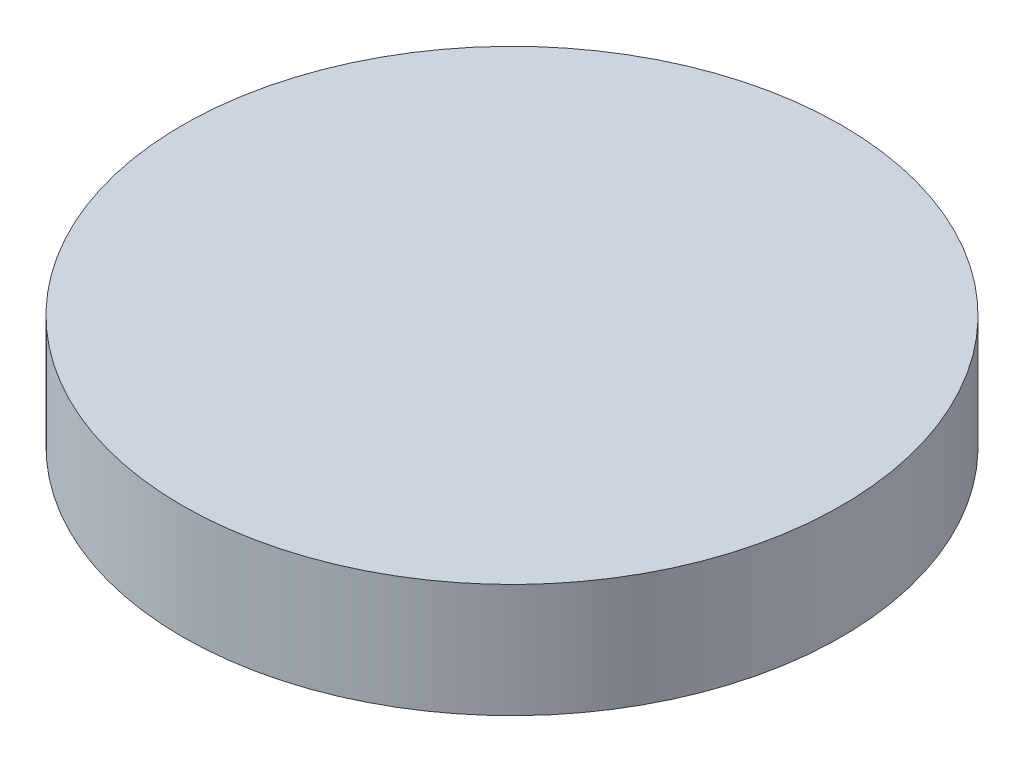
ISO-10303-21;
HEADER;
FILE_DESCRIPTION(('STEP AP214'),'2;1');
FILE_NAME('part.step','',(''),(''),'','','');
FILE_SCHEMA(('AUTOMOTIVE_DESIGN { 1 0 10303 214 1 1 1 1 }'));
ENDSEC;
DATA;
#1=APPLICATION_CONTEXT('core data for automotive mechanical design processes');
#2=APPLICATION_PROTOCOL_DEFINITION('international standard','automotive_design',2000,#1);
#3=PRODUCT_CONTEXT('',#1,'mechanical');
#4=PRODUCT('Part','Part','',(#3));
#5=PRODUCT_RELATED_PRODUCT_CATEGORY('part','',(#4));
#6=PRODUCT_DEFINITION_FORMATION('','',#4);
#7=PRODUCT_DEFINITION_CONTEXT('part definition',#1,'design');
#8=PRODUCT_DEFINITION('design','',#6,#7);
#9=PRODUCT_DEFINITION_SHAPE('','',#8);
#10=(LENGTH_UNIT() NAMED_UNIT(*) SI_UNIT(.MILLI.,.METRE.));
#11=(NAMED_UNIT(*) PLANE_ANGLE_UNIT() SI_UNIT($,.RADIAN.));
#12=(NAMED_UNIT(*) SI_UNIT($,.STERADIAN.) SOLID_ANGLE_UNIT());
#13=UNCERTAINTY_MEASURE_WITH_UNIT(LENGTH_MEASURE(1.E-05),#10,'distance_accuracy_value','');
#14=(GEOMETRIC_REPRESENTATION_CONTEXT(3) GLOBAL_UNCERTAINTY_ASSIGNED_CONTEXT((#13)) GLOBAL_UNIT_ASSIGNED_CONTEXT((#10,
#11,#12)) REPRESENTATION_CONTEXT('',''));
#15=CARTESIAN_POINT('',(0.,0.,0.));
#16=DIRECTION('',(0.,0.,1.));
#17=DIRECTION('',(1.,0.,0.));
#18=AXIS2_PLACEMENT_3D('',#15,#16,#17);
#19=CARTESIAN_POINT('',(0.,50.,0.));
#20=DIRECTION('',(0.,-1.,0.));
#21=DIRECTION('',(0.,0.,-1.));
#22=AXIS2_PLACEMENT_3D('',#19,#20,#21);
#23=CYLINDRICAL_SURFACE('',#22,145.);
#24=CARTESIAN_POINT('',(0.,50.,0.));
#25=DIRECTION('',(0.,1.,0.));
#26=DIRECTION('',(0.,0.,1.));
#27=AXIS2_PLACEMENT_3D('',#24,#25,#26);
#28=CIRCLE('',#27,145.);
#29=CARTESIAN_POINT('',(0.,50.,145.));
#30=VERTEX_POINT('',#29);
#31=EDGE_CURVE('E10',#30,#30,#28,.T.);
#32=ORIENTED_EDGE('',*,*,#31,.F.);
#33=EDGE_LOOP('',(#32));
#34=FACE_BOUND('',#33,.T.);
#35=CARTESIAN_POINT('',(0.,0.,0.));
#36=DIRECTION('',(0.,1.,0.));
#37=DIRECTION('',(0.,0.,1.));
#38=AXIS2_PLACEMENT_3D('',#35,#36,#37);
#39=CIRCLE('',#38,145.);
#40=CARTESIAN_POINT('',(0.,0.,145.));
#41=VERTEX_POINT('',#40);
#42=EDGE_CURVE('E39',#41,#41,#39,.T.);
#43=ORIENTED_EDGE('',*,*,#42,.T.);
#44=EDGE_LOOP('',(#43));
#45=FACE_BOUND('',#44,.T.);
#46=ADVANCED_FACE('F36',(#34,#45),#23,.T.);
#47=CARTESIAN_POINT('',(0.,50.,0.));
#48=DIRECTION('',(0.,1.,0.));
#49=DIRECTION('',(0.,0.,1.));
#50=AXIS2_PLACEMENT_3D('',#47,#48,#49);
#51=PLANE('',#50);
#52=ORIENTED_EDGE('',*,*,#31,.T.);
#53=EDGE_LOOP('',(#52));
#54=FACE_BOUND('',#53,.T.);
#55=ADVANCED_FACE('F53',(#54),#51,.T.);
#56=CARTESIAN_POINT('',(0.,0.,0.));
#57=DIRECTION('',(0.,1.,0.));
#58=DIRECTION('',(0.,0.,1.));
#59=AXIS2_PLACEMENT_3D('',#56,#57,#58);
#60=PLANE('',#59);
#61=ORIENTED_EDGE('',*,*,#42,.F.);
#62=EDGE_LOOP('',(#61));
#63=FACE_BOUND('',#62,.T.);
#64=ADVANCED_FACE('F51',(#63),#60,.F.);
#65=CLOSED_SHELL('',(#46,#55,#64));
#66=MANIFOLD_SOLID_BREP('B2',#65);
#67=ADVANCED_BREP_SHAPE_REPRESENTATION('',(#18,#66),#14);
#68=SHAPE_DEFINITION_REPRESENTATION(#9,#67);
ENDSEC;
END-ISO-10303-21;
